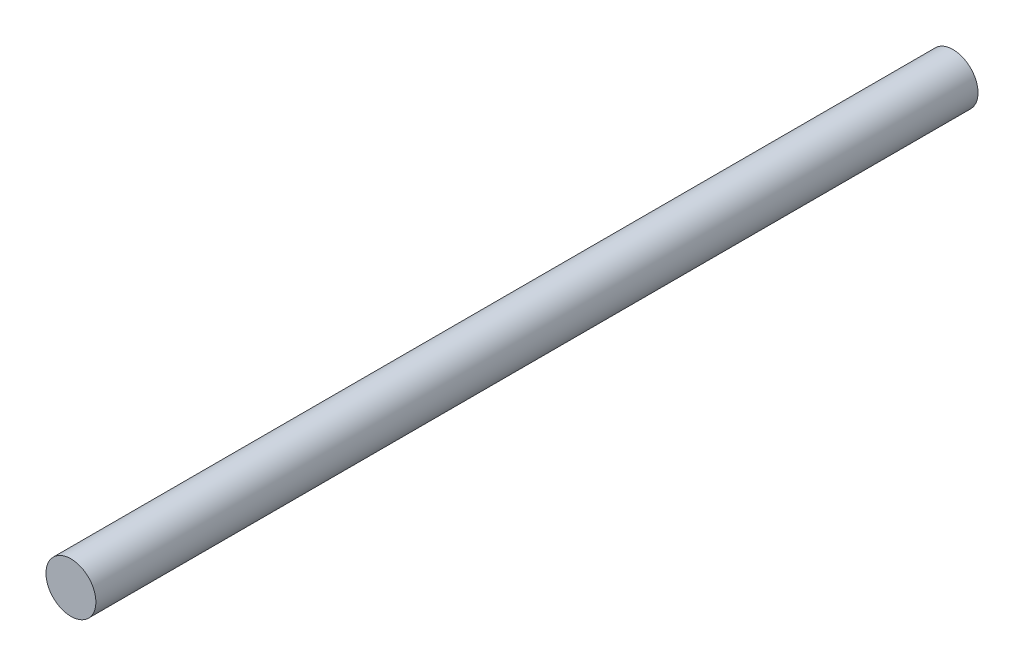
ISO-10303-21;
HEADER;
FILE_DESCRIPTION(('STEP AP214'),'2;1');
FILE_NAME('part.step','',(''),(''),'','','');
FILE_SCHEMA(('AUTOMOTIVE_DESIGN { 1 0 10303 214 1 1 1 1 }'));
ENDSEC;
DATA;
#1=APPLICATION_CONTEXT('core data for automotive mechanical design processes');
#2=APPLICATION_PROTOCOL_DEFINITION('international standard','automotive_design',2000,#1);
#3=PRODUCT_CONTEXT('',#1,'mechanical');
#4=PRODUCT('Part','Part','',(#3));
#5=PRODUCT_RELATED_PRODUCT_CATEGORY('part','',(#4));
#6=PRODUCT_DEFINITION_FORMATION('','',#4);
#7=PRODUCT_DEFINITION_CONTEXT('part definition',#1,'design');
#8=PRODUCT_DEFINITION('design','',#6,#7);
#9=PRODUCT_DEFINITION_SHAPE('','',#8);
#10=(LENGTH_UNIT() NAMED_UNIT(*) SI_UNIT(.MILLI.,.METRE.));
#11=(NAMED_UNIT(*) PLANE_ANGLE_UNIT() SI_UNIT($,.RADIAN.));
#12=(NAMED_UNIT(*) SI_UNIT($,.STERADIAN.) SOLID_ANGLE_UNIT());
#13=UNCERTAINTY_MEASURE_WITH_UNIT(LENGTH_MEASURE(1.E-05),#10,'distance_accuracy_value','');
#14=(GEOMETRIC_REPRESENTATION_CONTEXT(3) GLOBAL_UNCERTAINTY_ASSIGNED_CONTEXT((#13)) GLOBAL_UNIT_ASSIGNED_CONTEXT((#10,
#11,#12)) REPRESENTATION_CONTEXT('',''));
#15=CARTESIAN_POINT('',(0.,0.,0.));
#16=DIRECTION('',(0.,0.,1.));
#17=DIRECTION('',(1.,0.,0.));
#18=AXIS2_PLACEMENT_3D('',#15,#16,#17);
#19=CARTESIAN_POINT('',(0.,0.,106.));
#20=DIRECTION('',(0.,0.,-1.));
#21=DIRECTION('',(-1.,0.,0.));
#22=AXIS2_PLACEMENT_3D('',#19,#20,#21);
#23=CYLINDRICAL_SURFACE('',#22,3.);
#24=CARTESIAN_POINT('',(0.,0.,106.));
#25=DIRECTION('',(0.,0.,1.));
#26=DIRECTION('',(1.,0.,0.));
#27=AXIS2_PLACEMENT_3D('',#24,#25,#26);
#28=CIRCLE('',#27,3.);
#29=CARTESIAN_POINT('',(3.,0.,106.));
#30=VERTEX_POINT('',#29);
#31=EDGE_CURVE('E10',#30,#30,#28,.T.);
#32=ORIENTED_EDGE('',*,*,#31,.F.);
#33=EDGE_LOOP('',(#32));
#34=FACE_BOUND('',#33,.T.);
#35=CARTESIAN_POINT('',(0.,0.,0.));
#36=DIRECTION('',(0.,0.,1.));
#37=DIRECTION('',(1.,0.,0.));
#38=AXIS2_PLACEMENT_3D('',#35,#36,#37);
#39=CIRCLE('',#38,3.);
#40=CARTESIAN_POINT('',(3.,0.,0.));
#41=VERTEX_POINT('',#40);
#42=EDGE_CURVE('E42',#41,#41,#39,.T.);
#43=ORIENTED_EDGE('',*,*,#42,.T.);
#44=EDGE_LOOP('',(#43));
#45=FACE_BOUND('',#44,.T.);
#46=ADVANCED_FACE('F39',(#34,#45),#23,.T.);
#47=CARTESIAN_POINT('',(0.,0.,106.));
#48=DIRECTION('',(0.,0.,1.));
#49=DIRECTION('',(1.,0.,0.));
#50=AXIS2_PLACEMENT_3D('',#47,#48,#49);
#51=PLANE('',#50);
#52=ORIENTED_EDGE('',*,*,#31,.T.);
#53=EDGE_LOOP('',(#52));
#54=FACE_BOUND('',#53,.T.);
#55=ADVANCED_FACE('F54',(#54),#51,.T.);
#56=CARTESIAN_POINT('',(0.,0.,0.));
#57=DIRECTION('',(0.,0.,1.));
#58=DIRECTION('',(1.,0.,0.));
#59=AXIS2_PLACEMENT_3D('',#56,#57,#58);
#60=PLANE('',#59);
#61=ORIENTED_EDGE('',*,*,#42,.F.);
#62=EDGE_LOOP('',(#61));
#63=FACE_BOUND('',#62,.T.);
#64=ADVANCED_FACE('F52',(#63),#60,.F.);
#65=CLOSED_SHELL('',(#46,#55,#64));
#66=MANIFOLD_SOLID_BREP('B2',#65);
#67=ADVANCED_BREP_SHAPE_REPRESENTATION('',(#18,#66),#14);
#68=SHAPE_DEFINITION_REPRESENTATION(#9,#67);
ENDSEC;
END-ISO-10303-21;
